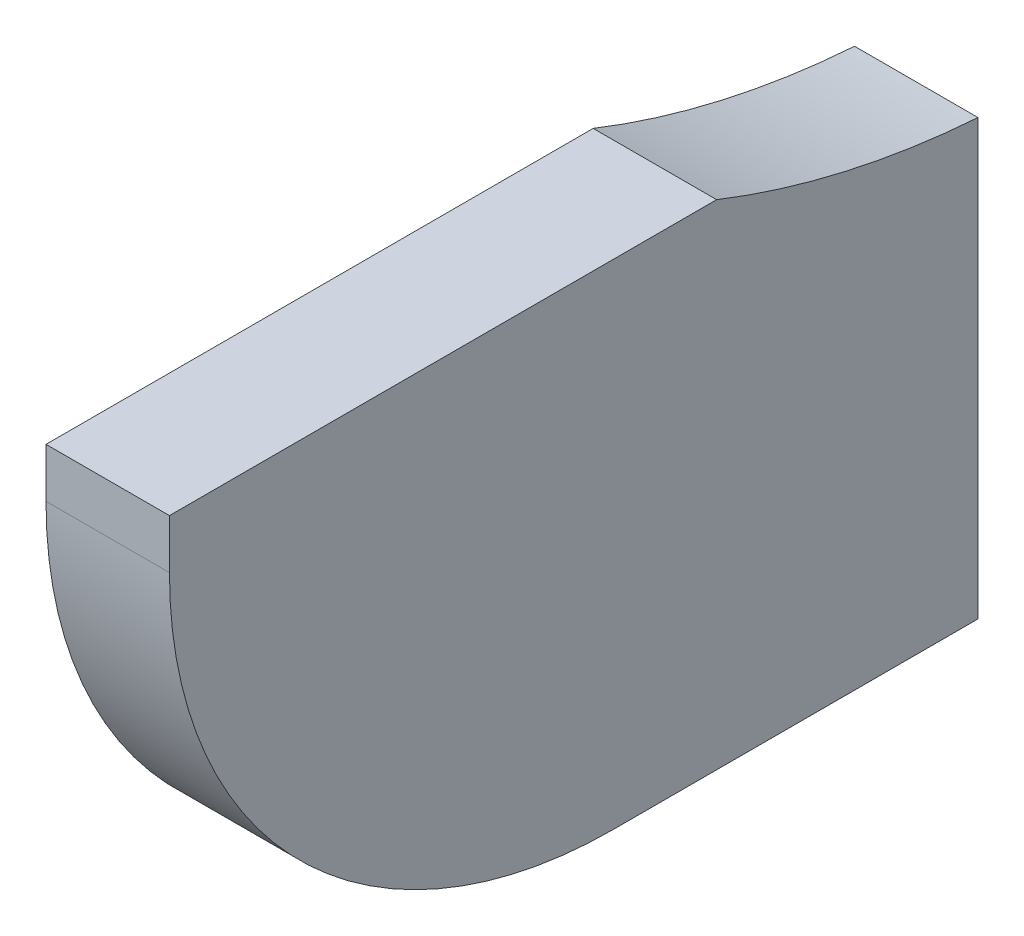
ISO-10303-21;
HEADER;
FILE_DESCRIPTION(('STEP AP214'),'2;1');
FILE_NAME('part.step','',(''),(''),'','','');
FILE_SCHEMA(('AUTOMOTIVE_DESIGN { 1 0 10303 214 1 1 1 1 }'));
ENDSEC;
DATA;
#1=APPLICATION_CONTEXT('core data for automotive mechanical design processes');
#2=APPLICATION_PROTOCOL_DEFINITION('international standard','automotive_design',2000,#1);
#3=PRODUCT_CONTEXT('',#1,'mechanical');
#4=PRODUCT('Part','Part','',(#3));
#5=PRODUCT_RELATED_PRODUCT_CATEGORY('part','',(#4));
#6=PRODUCT_DEFINITION_FORMATION('','',#4);
#7=PRODUCT_DEFINITION_CONTEXT('part definition',#1,'design');
#8=PRODUCT_DEFINITION('design','',#6,#7);
#9=PRODUCT_DEFINITION_SHAPE('','',#8);
#10=(LENGTH_UNIT() NAMED_UNIT(*) SI_UNIT(.MILLI.,.METRE.));
#11=(NAMED_UNIT(*) PLANE_ANGLE_UNIT() SI_UNIT($,.RADIAN.));
#12=(NAMED_UNIT(*) SI_UNIT($,.STERADIAN.) SOLID_ANGLE_UNIT());
#13=UNCERTAINTY_MEASURE_WITH_UNIT(LENGTH_MEASURE(1.E-05),#10,'distance_accuracy_value','');
#14=(GEOMETRIC_REPRESENTATION_CONTEXT(3) GLOBAL_UNCERTAINTY_ASSIGNED_CONTEXT((#13)) GLOBAL_UNIT_ASSIGNED_CONTEXT((#10,
#11,#12)) REPRESENTATION_CONTEXT('',''));
#15=CARTESIAN_POINT('',(0.,0.,0.));
#16=DIRECTION('',(0.,0.,1.));
#17=DIRECTION('',(1.,0.,0.));
#18=AXIS2_PLACEMENT_3D('',#15,#16,#17);
#19=CARTESIAN_POINT('',(-5.,20.,84.5));
#20=DIRECTION('',(0.,-1.,0.));
#21=DIRECTION('',(0.,0.,-1.));
#22=AXIS2_PLACEMENT_3D('',#19,#20,#21);
#23=PLANE('',#22);
#24=DIRECTION('',(0.,0.,-1.));
#25=VECTOR('',#24,1.);
#26=CARTESIAN_POINT('',(-5.,20.,84.5));
#27=LINE('',#26,#25);
#28=CARTESIAN_POINT('',(-5.,20.,77.5));
#29=VERTEX_POINT('',#28);
#30=CARTESIAN_POINT('',(-5.,20.,55.3362523283024));
#31=VERTEX_POINT('',#30);
#32=EDGE_CURVE('E97',#29,#31,#27,.T.);
#33=ORIENTED_EDGE('',*,*,#32,.F.);
#34=DIRECTION('',(-1.,0.,0.));
#35=VECTOR('',#34,1.);
#36=CARTESIAN_POINT('',(-5.,20.,77.5));
#37=LINE('',#36,#35);
#38=CARTESIAN_POINT('',(0.,20.,77.5));
#39=VERTEX_POINT('',#38);
#40=EDGE_CURVE('E86',#39,#29,#37,.T.);
#41=ORIENTED_EDGE('',*,*,#40,.F.);
#42=DIRECTION('',(0.,0.,-1.));
#43=VECTOR('',#42,1.);
#44=CARTESIAN_POINT('',(0.,20.,84.5));
#45=LINE('',#44,#43);
#46=CARTESIAN_POINT('',(0.,20.,55.3362523283024));
#47=VERTEX_POINT('',#46);
#48=EDGE_CURVE('E95',#39,#47,#45,.T.);
#49=ORIENTED_EDGE('',*,*,#48,.T.);
#50=DIRECTION('',(-1.,0.,0.));
#51=VECTOR('',#50,1.);
#52=CARTESIAN_POINT('',(35.,20.,55.3362523283025));
#53=LINE('',#52,#51);
#54=EDGE_CURVE('E113',#31,#47,#53,.F.);
#55=ORIENTED_EDGE('',*,*,#54,.F.);
#56=EDGE_LOOP('',(#33,#41,#49,#55));
#57=FACE_BOUND('',#56,.T.);
#58=ADVANCED_FACE('F34',(#57),#23,.F.);
#59=CARTESIAN_POINT('',(35.,53.,42.25));
#60=DIRECTION('',(-1.,0.,0.));
#61=DIRECTION('',(0.,-1.,0.));
#62=AXIS2_PLACEMENT_3D('',#59,#60,#61);
#63=CYLINDRICAL_SURFACE('',#62,35.5);
#64=DIRECTION('',(-1.,0.,0.));
#65=VECTOR('',#64,1.);
#66=CARTESIAN_POINT('',(35.,17.5881375807484,44.75));
#67=LINE('',#66,#65);
#68=CARTESIAN_POINT('',(-5.,17.5881375807484,44.75));
#69=VERTEX_POINT('',#68);
#70=CARTESIAN_POINT('',(0.,17.5881375807484,44.75));
#71=VERTEX_POINT('',#70);
#72=EDGE_CURVE('E115',#69,#71,#67,.F.);
#73=ORIENTED_EDGE('',*,*,#72,.F.);
#74=CARTESIAN_POINT('',(-5.,53.,42.25));
#75=DIRECTION('',(1.,0.,0.));
#76=DIRECTION('',(0.,1.,0.));
#77=AXIS2_PLACEMENT_3D('',#74,#75,#76);
#78=CIRCLE('',#77,35.5);
#79=EDGE_CURVE('E108',#69,#31,#78,.F.);
#80=ORIENTED_EDGE('',*,*,#79,.T.);
#81=ORIENTED_EDGE('',*,*,#54,.T.);
#82=CARTESIAN_POINT('',(0.,53.,42.25));
#83=DIRECTION('',(-1.,0.,0.));
#84=DIRECTION('',(0.,-1.,0.));
#85=AXIS2_PLACEMENT_3D('',#82,#83,#84);
#86=CIRCLE('',#85,35.5);
#87=EDGE_CURVE('E103',#47,#71,#86,.F.);
#88=ORIENTED_EDGE('',*,*,#87,.T.);
#89=EDGE_LOOP('',(#73,#80,#81,#88));
#90=FACE_BOUND('',#89,.T.);
#91=ADVANCED_FACE('F142',(#90),#63,.F.);
#92=CARTESIAN_POINT('',(-5.,0.,84.5));
#93=DIRECTION('',(0.,1.,0.));
#94=DIRECTION('',(0.,0.,1.));
#95=AXIS2_PLACEMENT_3D('',#92,#93,#94);
#96=PLANE('',#95);
#97=DIRECTION('',(0.,0.,-1.));
#98=VECTOR('',#97,1.);
#99=CARTESIAN_POINT('',(0.,0.,84.5));
#100=LINE('',#99,#98);
#101=CARTESIAN_POINT('',(0.,0.,59.5));
#102=VERTEX_POINT('',#101);
#103=CARTESIAN_POINT('',(0.,0.,44.75));
#104=VERTEX_POINT('',#103);
#105=EDGE_CURVE('E104',#102,#104,#100,.T.);
#106=ORIENTED_EDGE('',*,*,#105,.F.);
#107=DIRECTION('',(-1.,0.,0.));
#108=VECTOR('',#107,1.);
#109=CARTESIAN_POINT('',(-5.,0.,59.5));
#110=LINE('',#109,#108);
#111=CARTESIAN_POINT('',(-5.,0.,59.5));
#112=VERTEX_POINT('',#111);
#113=EDGE_CURVE('E119',#102,#112,#110,.T.);
#114=ORIENTED_EDGE('',*,*,#113,.T.);
#115=DIRECTION('',(0.,0.,-1.));
#116=VECTOR('',#115,1.);
#117=CARTESIAN_POINT('',(-5.,0.,84.5));
#118=LINE('',#117,#116);
#119=CARTESIAN_POINT('',(-5.,0.,44.75));
#120=VERTEX_POINT('',#119);
#121=EDGE_CURVE('E106',#112,#120,#118,.T.);
#122=ORIENTED_EDGE('',*,*,#121,.T.);
#123=DIRECTION('',(-1.,0.,0.));
#124=VECTOR('',#123,1.);
#125=CARTESIAN_POINT('',(8.,0.,44.75));
#126=LINE('',#125,#124);
#127=EDGE_CURVE('E135',#104,#120,#126,.T.);
#128=ORIENTED_EDGE('',*,*,#127,.F.);
#129=EDGE_LOOP('',(#106,#114,#122,#128));
#130=FACE_BOUND('',#129,.T.);
#131=ADVANCED_FACE('F125',(#130),#96,.F.);
#132=CARTESIAN_POINT('',(0.,20.,84.5));
#133=DIRECTION('',(-1.,0.,0.));
#134=DIRECTION('',(0.,-1.,0.));
#135=AXIS2_PLACEMENT_3D('',#132,#133,#134);
#136=PLANE('',#135);
#137=DIRECTION('',(0.,1.,0.));
#138=VECTOR('',#137,1.);
#139=CARTESIAN_POINT('',(0.,-4.00000000000001,77.5));
#140=LINE('',#139,#138);
#141=CARTESIAN_POINT('',(0.,18.,77.5));
#142=VERTEX_POINT('',#141);
#143=EDGE_CURVE('E83',#142,#39,#140,.T.);
#144=ORIENTED_EDGE('',*,*,#143,.F.);
#145=CARTESIAN_POINT('',(0.,18.,59.5));
#146=DIRECTION('',(-1.,0.,0.));
#147=DIRECTION('',(0.,-1.,0.));
#148=AXIS2_PLACEMENT_3D('',#145,#146,#147);
#149=CIRCLE('',#148,18.);
#150=EDGE_CURVE('E11',#142,#102,#149,.F.);
#151=ORIENTED_EDGE('',*,*,#150,.T.);
#152=ORIENTED_EDGE('',*,*,#105,.T.);
#153=DIRECTION('',(0.,1.,0.));
#154=VECTOR('',#153,1.);
#155=CARTESIAN_POINT('',(0.,20.,44.75));
#156=LINE('',#155,#154);
#157=EDGE_CURVE('E137',#104,#71,#156,.T.);
#158=ORIENTED_EDGE('',*,*,#157,.T.);
#159=ORIENTED_EDGE('',*,*,#87,.F.);
#160=ORIENTED_EDGE('',*,*,#48,.F.);
#161=EDGE_LOOP('',(#144,#151,#152,#158,#159,#160));
#162=FACE_BOUND('',#161,.T.);
#163=ADVANCED_FACE('F100',(#162),#136,.F.);
#164=CARTESIAN_POINT('',(-5.,20.,84.5));
#165=DIRECTION('',(1.,0.,0.));
#166=DIRECTION('',(0.,1.,0.));
#167=AXIS2_PLACEMENT_3D('',#164,#165,#166);
#168=PLANE('',#167);
#169=ORIENTED_EDGE('',*,*,#121,.F.);
#170=CARTESIAN_POINT('',(-5.,18.,59.5));
#171=DIRECTION('',(1.,0.,0.));
#172=DIRECTION('',(0.,1.,0.));
#173=AXIS2_PLACEMENT_3D('',#170,#171,#172);
#174=CIRCLE('',#173,18.);
#175=CARTESIAN_POINT('',(-5.,18.,77.5));
#176=VERTEX_POINT('',#175);
#177=EDGE_CURVE('E56',#112,#176,#174,.F.);
#178=ORIENTED_EDGE('',*,*,#177,.T.);
#179=DIRECTION('',(0.,1.,0.));
#180=VECTOR('',#179,1.);
#181=CARTESIAN_POINT('',(-5.,20.,77.5));
#182=LINE('',#181,#180);
#183=EDGE_CURVE('E117',#176,#29,#182,.T.);
#184=ORIENTED_EDGE('',*,*,#183,.T.);
#185=ORIENTED_EDGE('',*,*,#32,.T.);
#186=ORIENTED_EDGE('',*,*,#79,.F.);
#187=DIRECTION('',(0.,1.,0.));
#188=VECTOR('',#187,1.);
#189=CARTESIAN_POINT('',(-5.,0.,44.75));
#190=LINE('',#189,#188);
#191=EDGE_CURVE('E91',#120,#69,#190,.T.);
#192=ORIENTED_EDGE('',*,*,#191,.F.);
#193=EDGE_LOOP('',(#169,#178,#184,#185,#186,#192));
#194=FACE_BOUND('',#193,.T.);
#195=ADVANCED_FACE('F130',(#194),#168,.F.);
#196=CARTESIAN_POINT('',(8.,0.,44.75));
#197=DIRECTION('',(0.,0.,1.));
#198=DIRECTION('',(1.,0.,0.));
#199=AXIS2_PLACEMENT_3D('',#196,#197,#198);
#200=PLANE('',#199);
#201=ORIENTED_EDGE('',*,*,#127,.T.);
#202=ORIENTED_EDGE('',*,*,#191,.T.);
#203=ORIENTED_EDGE('',*,*,#72,.T.);
#204=ORIENTED_EDGE('',*,*,#157,.F.);
#205=EDGE_LOOP('',(#201,#202,#203,#204));
#206=FACE_BOUND('',#205,.T.);
#207=ADVANCED_FACE('F144',(#206),#200,.F.);
#208=CARTESIAN_POINT('',(-5.,-4.00000000000001,77.5));
#209=DIRECTION('',(0.,0.,-1.));
#210=DIRECTION('',(-1.,0.,0.));
#211=AXIS2_PLACEMENT_3D('',#208,#209,#210);
#212=PLANE('',#211);
#213=ORIENTED_EDGE('',*,*,#183,.F.);
#214=DIRECTION('',(-1.,0.,0.));
#215=VECTOR('',#214,1.);
#216=CARTESIAN_POINT('',(-5.,18.,77.5));
#217=LINE('',#216,#215);
#218=EDGE_CURVE('E42',#176,#142,#217,.F.);
#219=ORIENTED_EDGE('',*,*,#218,.T.);
#220=ORIENTED_EDGE('',*,*,#143,.T.);
#221=ORIENTED_EDGE('',*,*,#40,.T.);
#222=EDGE_LOOP('',(#213,#219,#220,#221));
#223=FACE_BOUND('',#222,.T.);
#224=ADVANCED_FACE('F85',(#223),#212,.F.);
#225=CARTESIAN_POINT('',(-5.,18.,59.5));
#226=DIRECTION('',(-1.,0.,0.));
#227=DIRECTION('',(0.,0.,1.));
#228=AXIS2_PLACEMENT_3D('',#225,#226,#227);
#229=CYLINDRICAL_SURFACE('',#228,18.);
#230=ORIENTED_EDGE('',*,*,#150,.F.);
#231=ORIENTED_EDGE('',*,*,#218,.F.);
#232=ORIENTED_EDGE('',*,*,#177,.F.);
#233=ORIENTED_EDGE('',*,*,#113,.F.);
#234=EDGE_LOOP('',(#230,#231,#232,#233));
#235=FACE_BOUND('',#234,.T.);
#236=ADVANCED_FACE('F36',(#235),#229,.T.);
#237=CLOSED_SHELL('',(#58,#91,#131,#163,#195,#207,#224,#236));
#238=MANIFOLD_SOLID_BREP('B2',#237);
#239=ADVANCED_BREP_SHAPE_REPRESENTATION('',(#18,#238),#14);
#240=SHAPE_DEFINITION_REPRESENTATION(#9,#239);
ENDSEC;
END-ISO-10303-21;
